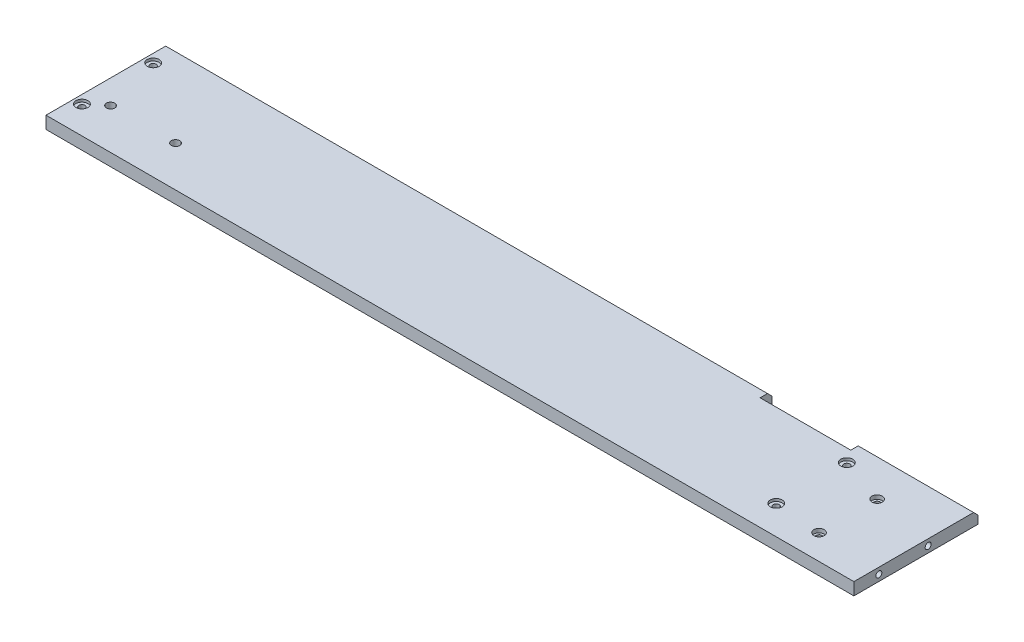
ISO-10303-21;
HEADER;
FILE_DESCRIPTION(('STEP AP214'),'2;1');
FILE_NAME('part.step','',(''),(''),'','','');
FILE_SCHEMA(('AUTOMOTIVE_DESIGN { 1 0 10303 214 1 1 1 1 }'));
ENDSEC;
DATA;
#1=APPLICATION_CONTEXT('core data for automotive mechanical design processes');
#2=APPLICATION_PROTOCOL_DEFINITION('international standard','automotive_design',2000,#1);
#3=PRODUCT_CONTEXT('',#1,'mechanical');
#4=PRODUCT('Part','Part','',(#3));
#5=PRODUCT_RELATED_PRODUCT_CATEGORY('part','',(#4));
#6=PRODUCT_DEFINITION_FORMATION('','',#4);
#7=PRODUCT_DEFINITION_CONTEXT('part definition',#1,'design');
#8=PRODUCT_DEFINITION('design','',#6,#7);
#9=PRODUCT_DEFINITION_SHAPE('','',#8);
#10=(LENGTH_UNIT() NAMED_UNIT(*) SI_UNIT(.MILLI.,.METRE.));
#11=(NAMED_UNIT(*) PLANE_ANGLE_UNIT() SI_UNIT($,.RADIAN.));
#12=(NAMED_UNIT(*) SI_UNIT($,.STERADIAN.) SOLID_ANGLE_UNIT());
#13=UNCERTAINTY_MEASURE_WITH_UNIT(LENGTH_MEASURE(1.E-05),#10,'distance_accuracy_value','');
#14=(GEOMETRIC_REPRESENTATION_CONTEXT(3) GLOBAL_UNCERTAINTY_ASSIGNED_CONTEXT((#13)) GLOBAL_UNIT_ASSIGNED_CONTEXT((#10,
#11,#12)) REPRESENTATION_CONTEXT('',''));
#15=CARTESIAN_POINT('',(0.,0.,0.));
#16=DIRECTION('',(0.,0.,1.));
#17=DIRECTION('',(1.,0.,0.));
#18=AXIS2_PLACEMENT_3D('',#15,#16,#17);
#19=CARTESIAN_POINT('',(0.,9.55,0.));
#20=DIRECTION('',(0.,0.,1.));
#21=DIRECTION('',(1.,0.,0.));
#22=AXIS2_PLACEMENT_3D('',#19,#20,#21);
#23=PLANE('',#22);
#24=DIRECTION('',(-1.,0.,0.));
#25=VECTOR('',#24,1.);
#26=CARTESIAN_POINT('',(0.,0.,0.));
#27=LINE('',#26,#25);
#28=CARTESIAN_POINT('',(622.,0.,0.));
#29=VERTEX_POINT('',#28);
#30=CARTESIAN_POINT('',(533.15,0.,0.));
#31=VERTEX_POINT('',#30);
#32=EDGE_CURVE('E238',#29,#31,#27,.T.);
#33=ORIENTED_EDGE('',*,*,#32,.T.);
#34=DIRECTION('',(0.,-1.,0.));
#35=VECTOR('',#34,1.);
#36=CARTESIAN_POINT('',(533.15,9.55,0.));
#37=LINE('',#36,#35);
#38=CARTESIAN_POINT('',(533.15,6.15000000000004,0.));
#39=VERTEX_POINT('',#38);
#40=EDGE_CURVE('E146',#39,#31,#37,.T.);
#41=ORIENTED_EDGE('',*,*,#40,.F.);
#42=DIRECTION('',(1.,0.,0.));
#43=VECTOR('',#42,1.);
#44=CARTESIAN_POINT('',(622.,6.15000000000004,0.));
#45=LINE('',#44,#43);
#46=CARTESIAN_POINT('',(622.,6.15000000000004,0.));
#47=VERTEX_POINT('',#46);
#48=EDGE_CURVE('E55',#39,#47,#45,.T.);
#49=ORIENTED_EDGE('',*,*,#48,.T.);
#50=DIRECTION('',(0.,-1.,0.));
#51=VECTOR('',#50,1.);
#52=CARTESIAN_POINT('',(622.,9.55,0.));
#53=LINE('',#52,#51);
#54=EDGE_CURVE('E255',#47,#29,#53,.T.);
#55=ORIENTED_EDGE('',*,*,#54,.T.);
#56=EDGE_LOOP('',(#33,#41,#49,#55));
#57=FACE_BOUND('',#56,.T.);
#58=ADVANCED_FACE('F32',(#57),#23,.F.);
#59=CARTESIAN_POINT('',(0.,9.55,3.39999999999996));
#60=DIRECTION('',(0.,0.707106781186548,-0.707106781186548));
#61=DIRECTION('',(0.,0.707106781186548,0.707106781186548));
#62=AXIS2_PLACEMENT_3D('',#59,#60,#61);
#63=PLANE('',#62);
#64=DIRECTION('',(0.,-0.707106781186548,-0.707106781186548));
#65=VECTOR('',#64,1.);
#66=CARTESIAN_POINT('',(533.15,9.55,3.39999999999996));
#67=LINE('',#66,#65);
#68=CARTESIAN_POINT('',(533.15,9.55,3.39999999999996));
#69=VERTEX_POINT('',#68);
#70=EDGE_CURVE('E11',#69,#39,#67,.T.);
#71=ORIENTED_EDGE('',*,*,#70,.F.);
#72=DIRECTION('',(-1.,0.,0.));
#73=VECTOR('',#72,1.);
#74=CARTESIAN_POINT('',(0.,9.55,3.39999999999996));
#75=LINE('',#74,#73);
#76=CARTESIAN_POINT('',(622.,9.55,3.39999999999996));
#77=VERTEX_POINT('',#76);
#78=EDGE_CURVE('E134',#77,#69,#75,.T.);
#79=ORIENTED_EDGE('',*,*,#78,.F.);
#80=DIRECTION('',(0.,0.707106781186548,0.707106781186548));
#81=VECTOR('',#80,1.);
#82=CARTESIAN_POINT('',(622.,9.55,3.39999999999996));
#83=LINE('',#82,#81);
#84=EDGE_CURVE('E270',#47,#77,#83,.T.);
#85=ORIENTED_EDGE('',*,*,#84,.F.);
#86=ORIENTED_EDGE('',*,*,#48,.F.);
#87=EDGE_LOOP('',(#71,#79,#85,#86));
#88=FACE_BOUND('',#87,.T.);
#89=ADVANCED_FACE('F291',(#88),#63,.T.);
#90=CARTESIAN_POINT('',(0.,9.55,0.));
#91=DIRECTION('',(1.,0.,0.));
#92=DIRECTION('',(0.,0.,-1.));
#93=AXIS2_PLACEMENT_3D('',#90,#91,#92);
#94=PLANE('',#93);
#95=DIRECTION('',(0.,0.,1.));
#96=VECTOR('',#95,1.);
#97=CARTESIAN_POINT('',(0.,9.55,0.));
#98=LINE('',#97,#96);
#99=CARTESIAN_POINT('',(0.,9.55,3.39999999999996));
#100=VERTEX_POINT('',#99);
#101=CARTESIAN_POINT('',(0.,9.55,95.56));
#102=VERTEX_POINT('',#101);
#103=EDGE_CURVE('E235',#100,#102,#98,.T.);
#104=ORIENTED_EDGE('',*,*,#103,.F.);
#105=DIRECTION('',(0.,-0.707106781186548,-0.707106781186548));
#106=VECTOR('',#105,1.);
#107=CARTESIAN_POINT('',(0.,9.55,3.39999999999996));
#108=LINE('',#107,#106);
#109=CARTESIAN_POINT('',(0.,6.15000000000004,0.));
#110=VERTEX_POINT('',#109);
#111=EDGE_CURVE('E265',#100,#110,#108,.T.);
#112=ORIENTED_EDGE('',*,*,#111,.T.);
#113=DIRECTION('',(0.,-1.,0.));
#114=VECTOR('',#113,1.);
#115=CARTESIAN_POINT('',(0.,9.55,0.));
#116=LINE('',#115,#114);
#117=CARTESIAN_POINT('',(0.,0.,0.));
#118=VERTEX_POINT('',#117);
#119=EDGE_CURVE('E242',#110,#118,#116,.T.);
#120=ORIENTED_EDGE('',*,*,#119,.T.);
#121=DIRECTION('',(0.,0.,1.));
#122=VECTOR('',#121,1.);
#123=CARTESIAN_POINT('',(0.,0.,0.));
#124=LINE('',#123,#122);
#125=CARTESIAN_POINT('',(0.,0.,95.56));
#126=VERTEX_POINT('',#125);
#127=EDGE_CURVE('E234',#118,#126,#124,.T.);
#128=ORIENTED_EDGE('',*,*,#127,.T.);
#129=DIRECTION('',(0.,-1.,0.));
#130=VECTOR('',#129,1.);
#131=CARTESIAN_POINT('',(0.,9.55,95.56));
#132=LINE('',#131,#130);
#133=EDGE_CURVE('E260',#102,#126,#132,.T.);
#134=ORIENTED_EDGE('',*,*,#133,.F.);
#135=EDGE_LOOP('',(#104,#112,#120,#128,#134));
#136=FACE_BOUND('',#135,.T.);
#137=ADVANCED_FACE('F280',(#136),#94,.F.);
#138=CARTESIAN_POINT('',(0.,9.55,95.56));
#139=DIRECTION('',(0.,0.,-1.));
#140=DIRECTION('',(-1.,0.,0.));
#141=AXIS2_PLACEMENT_3D('',#138,#139,#140);
#142=PLANE('',#141);
#143=DIRECTION('',(1.,0.,0.));
#144=VECTOR('',#143,1.);
#145=CARTESIAN_POINT('',(0.,0.,95.56));
#146=LINE('',#145,#144);
#147=CARTESIAN_POINT('',(622.,0.,95.56));
#148=VERTEX_POINT('',#147);
#149=EDGE_CURVE('E245',#126,#148,#146,.T.);
#150=ORIENTED_EDGE('',*,*,#149,.T.);
#151=DIRECTION('',(0.,-1.,0.));
#152=VECTOR('',#151,1.);
#153=CARTESIAN_POINT('',(622.,9.55,95.56));
#154=LINE('',#153,#152);
#155=CARTESIAN_POINT('',(622.,9.55,95.56));
#156=VERTEX_POINT('',#155);
#157=EDGE_CURVE('E257',#156,#148,#154,.T.);
#158=ORIENTED_EDGE('',*,*,#157,.F.);
#159=DIRECTION('',(1.,0.,0.));
#160=VECTOR('',#159,1.);
#161=CARTESIAN_POINT('',(0.,9.55,95.56));
#162=LINE('',#161,#160);
#163=EDGE_CURVE('E237',#102,#156,#162,.T.);
#164=ORIENTED_EDGE('',*,*,#163,.F.);
#165=ORIENTED_EDGE('',*,*,#133,.T.);
#166=EDGE_LOOP('',(#150,#158,#164,#165));
#167=FACE_BOUND('',#166,.T.);
#168=ADVANCED_FACE('F284',(#167),#142,.F.);
#169=CARTESIAN_POINT('',(622.,9.55,0.));
#170=DIRECTION('',(-1.,0.,0.));
#171=DIRECTION('',(0.,0.,1.));
#172=AXIS2_PLACEMENT_3D('',#169,#170,#171);
#173=PLANE('',#172);
#174=CARTESIAN_POINT('',(622.,4.775,76.36));
#175=DIRECTION('',(1.,0.,0.));
#176=DIRECTION('',(0.,0.,-1.));
#177=AXIS2_PLACEMENT_3D('',#174,#175,#176);
#178=CIRCLE('',#177,2.30000000000001);
#179=CARTESIAN_POINT('',(622.,4.775,74.06));
#180=VERTEX_POINT('',#179);
#181=EDGE_CURVE('E701',#180,#180,#178,.T.);
#182=ORIENTED_EDGE('',*,*,#181,.F.);
#183=EDGE_LOOP('',(#182));
#184=FACE_BOUND('',#183,.T.);
#185=CARTESIAN_POINT('',(622.,4.775,38.38));
#186=DIRECTION('',(1.,0.,0.));
#187=DIRECTION('',(0.,0.,-1.));
#188=AXIS2_PLACEMENT_3D('',#185,#186,#187);
#189=CIRCLE('',#188,2.30000000000001);
#190=CARTESIAN_POINT('',(622.,4.775,36.08));
#191=VERTEX_POINT('',#190);
#192=EDGE_CURVE('E703',#191,#191,#189,.T.);
#193=ORIENTED_EDGE('',*,*,#192,.F.);
#194=EDGE_LOOP('',(#193));
#195=FACE_BOUND('',#194,.T.);
#196=ORIENTED_EDGE('',*,*,#54,.F.);
#197=ORIENTED_EDGE('',*,*,#84,.T.);
#198=DIRECTION('',(0.,0.,-1.));
#199=VECTOR('',#198,1.);
#200=CARTESIAN_POINT('',(622.,9.55,0.));
#201=LINE('',#200,#199);
#202=EDGE_CURVE('E240',#156,#77,#201,.T.);
#203=ORIENTED_EDGE('',*,*,#202,.F.);
#204=ORIENTED_EDGE('',*,*,#157,.T.);
#205=DIRECTION('',(0.,0.,-1.));
#206=VECTOR('',#205,1.);
#207=CARTESIAN_POINT('',(622.,0.,0.));
#208=LINE('',#207,#206);
#209=EDGE_CURVE('E247',#148,#29,#208,.T.);
#210=ORIENTED_EDGE('',*,*,#209,.T.);
#211=EDGE_LOOP('',(#196,#197,#203,#204,#210));
#212=FACE_BOUND('',#211,.T.);
#213=ADVANCED_FACE('F288',(#184,#195,#212),#173,.F.);
#214=CARTESIAN_POINT('',(463.34,6.15000000000004,0.));
#215=VERTEX_POINT('',#214);
#216=EDGE_CURVE('E267',#110,#215,#45,.T.);
#217=ORIENTED_EDGE('',*,*,#216,.T.);
#218=DIRECTION('',(0.,-1.,0.));
#219=VECTOR('',#218,1.);
#220=CARTESIAN_POINT('',(463.34,9.55,0.));
#221=LINE('',#220,#219);
#222=CARTESIAN_POINT('',(463.34,0.,0.));
#223=VERTEX_POINT('',#222);
#224=EDGE_CURVE('E47',#215,#223,#221,.T.);
#225=ORIENTED_EDGE('',*,*,#224,.T.);
#226=EDGE_CURVE('E250',#223,#118,#27,.T.);
#227=ORIENTED_EDGE('',*,*,#226,.T.);
#228=ORIENTED_EDGE('',*,*,#119,.F.);
#229=EDGE_LOOP('',(#217,#225,#227,#228));
#230=FACE_BOUND('',#229,.T.);
#231=ADVANCED_FACE('F299',(#230),#23,.F.);
#232=CARTESIAN_POINT('',(0.,9.55,95.56));
#233=DIRECTION('',(0.,1.,0.));
#234=DIRECTION('',(0.,0.,1.));
#235=AXIS2_PLACEMENT_3D('',#232,#233,#234);
#236=PLANE('',#235);
#237=DIRECTION('',(0.,0.,1.));
#238=VECTOR('',#237,1.);
#239=CARTESIAN_POINT('',(533.15,9.55,0.));
#240=LINE('',#239,#238);
#241=CARTESIAN_POINT('',(533.15,9.55,9.1));
#242=VERTEX_POINT('',#241);
#243=EDGE_CURVE('E112',#69,#242,#240,.T.);
#244=ORIENTED_EDGE('',*,*,#243,.T.);
#245=DIRECTION('',(-1.,0.,0.));
#246=VECTOR('',#245,1.);
#247=CARTESIAN_POINT('',(533.15,9.55,9.1));
#248=LINE('',#247,#246);
#249=CARTESIAN_POINT('',(463.34,9.55,9.09999999999999));
#250=VERTEX_POINT('',#249);
#251=EDGE_CURVE('E123',#242,#250,#248,.T.);
#252=ORIENTED_EDGE('',*,*,#251,.T.);
#253=DIRECTION('',(0.,0.,-1.));
#254=VECTOR('',#253,1.);
#255=CARTESIAN_POINT('',(463.34,9.55,0.));
#256=LINE('',#255,#254);
#257=CARTESIAN_POINT('',(463.34,9.55,3.39999999999996));
#258=VERTEX_POINT('',#257);
#259=EDGE_CURVE('E120',#250,#258,#256,.T.);
#260=ORIENTED_EDGE('',*,*,#259,.T.);
#261=EDGE_CURVE('E263',#258,#100,#75,.T.);
#262=ORIENTED_EDGE('',*,*,#261,.T.);
#263=ORIENTED_EDGE('',*,*,#103,.T.);
#264=ORIENTED_EDGE('',*,*,#163,.T.);
#265=ORIENTED_EDGE('',*,*,#202,.T.);
#266=ORIENTED_EDGE('',*,*,#78,.T.);
#267=EDGE_LOOP('',(#244,#252,#260,#262,#263,#264,#265,#266));
#268=FACE_BOUND('',#267,.T.);
#269=CARTESIAN_POINT('',(575.95,9.55,31.61));
#270=DIRECTION('',(0.,1.,0.));
#271=DIRECTION('',(0.,0.,1.));
#272=AXIS2_PLACEMENT_3D('',#269,#270,#271);
#273=CIRCLE('',#272,4.);
#274=CARTESIAN_POINT('',(575.95,9.55,35.61));
#275=VERTEX_POINT('',#274);
#276=EDGE_CURVE('E148',#275,#275,#273,.T.);
#277=ORIENTED_EDGE('',*,*,#276,.F.);
#278=EDGE_LOOP('',(#277));
#279=FACE_BOUND('',#278,.T.);
#280=CARTESIAN_POINT('',(575.95,9.55,76.32));
#281=DIRECTION('',(0.,1.,0.));
#282=DIRECTION('',(0.,0.,1.));
#283=AXIS2_PLACEMENT_3D('',#280,#281,#282);
#284=CIRCLE('',#283,4.);
#285=CARTESIAN_POINT('',(575.95,9.55,80.32));
#286=VERTEX_POINT('',#285);
#287=EDGE_CURVE('E162',#286,#286,#284,.T.);
#288=ORIENTED_EDGE('',*,*,#287,.F.);
#289=EDGE_LOOP('',(#288));
#290=FACE_BOUND('',#289,.T.);
#291=CARTESIAN_POINT('',(6.4,9.55,19.45));
#292=DIRECTION('',(0.,1.,0.));
#293=DIRECTION('',(0.,0.,1.));
#294=AXIS2_PLACEMENT_3D('',#291,#292,#293);
#295=CIRCLE('',#294,4.60000000000001);
#296=CARTESIAN_POINT('',(6.4,9.55,24.05));
#297=VERTEX_POINT('',#296);
#298=EDGE_CURVE('E174',#297,#297,#295,.T.);
#299=ORIENTED_EDGE('',*,*,#298,.F.);
#300=EDGE_LOOP('',(#299));
#301=FACE_BOUND('',#300,.T.);
#302=CARTESIAN_POINT('',(6.4,9.55,74.31));
#303=DIRECTION('',(0.,1.,0.));
#304=DIRECTION('',(0.,0.,1.));
#305=AXIS2_PLACEMENT_3D('',#302,#303,#304);
#306=CIRCLE('',#305,4.60000000000001);
#307=CARTESIAN_POINT('',(6.4,9.55,78.91));
#308=VERTEX_POINT('',#307);
#309=EDGE_CURVE('E186',#308,#308,#306,.T.);
#310=ORIENTED_EDGE('',*,*,#309,.F.);
#311=EDGE_LOOP('',(#310));
#312=FACE_BOUND('',#311,.T.);
#313=CARTESIAN_POINT('',(539.95,9.55,18.95));
#314=DIRECTION('',(0.,1.,0.));
#315=DIRECTION('',(0.,0.,1.));
#316=AXIS2_PLACEMENT_3D('',#313,#314,#315);
#317=CIRCLE('',#316,4.60000000000005);
#318=CARTESIAN_POINT('',(539.95,9.55,23.5500000000001));
#319=VERTEX_POINT('',#318);
#320=EDGE_CURVE('E198',#319,#319,#317,.T.);
#321=ORIENTED_EDGE('',*,*,#320,.F.);
#322=EDGE_LOOP('',(#321));
#323=FACE_BOUND('',#322,.T.);
#324=CARTESIAN_POINT('',(539.95,9.55,73.28));
#325=DIRECTION('',(0.,1.,0.));
#326=DIRECTION('',(0.,0.,1.));
#327=AXIS2_PLACEMENT_3D('',#324,#325,#326);
#328=CIRCLE('',#327,4.60000000000005);
#329=CARTESIAN_POINT('',(539.95,9.55,77.8800000000001));
#330=VERTEX_POINT('',#329);
#331=EDGE_CURVE('E210',#330,#330,#328,.T.);
#332=ORIENTED_EDGE('',*,*,#331,.F.);
#333=EDGE_LOOP('',(#332));
#334=FACE_BOUND('',#333,.T.);
#335=CARTESIAN_POINT('',(18.475,9.55,64.285));
#336=DIRECTION('',(0.,1.,0.));
#337=DIRECTION('',(0.,0.,1.));
#338=AXIS2_PLACEMENT_3D('',#335,#336,#337);
#339=CIRCLE('',#338,3.25000000000001);
#340=CARTESIAN_POINT('',(18.475,9.55,67.535));
#341=VERTEX_POINT('',#340);
#342=EDGE_CURVE('E222',#341,#341,#339,.T.);
#343=ORIENTED_EDGE('',*,*,#342,.F.);
#344=EDGE_LOOP('',(#343));
#345=FACE_BOUND('',#344,.T.);
#346=CARTESIAN_POINT('',(68.475,9.55,64.285));
#347=DIRECTION('',(0.,1.,0.));
#348=DIRECTION('',(0.,0.,1.));
#349=AXIS2_PLACEMENT_3D('',#346,#347,#348);
#350=CIRCLE('',#349,3.25000000000002);
#351=CARTESIAN_POINT('',(68.475,9.55,67.535));
#352=VERTEX_POINT('',#351);
#353=EDGE_CURVE('E228',#352,#352,#350,.T.);
#354=ORIENTED_EDGE('',*,*,#353,.F.);
#355=EDGE_LOOP('',(#354));
#356=FACE_BOUND('',#355,.T.);
#357=ADVANCED_FACE('F130',(#268,#279,#290,#301,#312,#323,#334,#345,#356),#236,.T.);
#358=CARTESIAN_POINT('',(0.,0.,95.56));
#359=DIRECTION('',(0.,1.,0.));
#360=DIRECTION('',(0.,0.,1.));
#361=AXIS2_PLACEMENT_3D('',#358,#359,#360);
#362=PLANE('',#361);
#363=CARTESIAN_POINT('',(575.95,0.,31.61));
#364=DIRECTION('',(0.,1.,0.));
#365=DIRECTION('',(0.,0.,1.));
#366=AXIS2_PLACEMENT_3D('',#363,#364,#365);
#367=CIRCLE('',#366,2.29999999999997);
#368=CARTESIAN_POINT('',(575.95,0.,33.91));
#369=VERTEX_POINT('',#368);
#370=EDGE_CURVE('E159',#369,#369,#367,.T.);
#371=ORIENTED_EDGE('',*,*,#370,.T.);
#372=EDGE_LOOP('',(#371));
#373=FACE_BOUND('',#372,.T.);
#374=CARTESIAN_POINT('',(575.95,0.,76.32));
#375=DIRECTION('',(0.,1.,0.));
#376=DIRECTION('',(0.,0.,1.));
#377=AXIS2_PLACEMENT_3D('',#374,#375,#376);
#378=CIRCLE('',#377,2.29999999999997);
#379=CARTESIAN_POINT('',(575.95,0.,78.62));
#380=VERTEX_POINT('',#379);
#381=EDGE_CURVE('E171',#380,#380,#378,.T.);
#382=ORIENTED_EDGE('',*,*,#381,.T.);
#383=EDGE_LOOP('',(#382));
#384=FACE_BOUND('',#383,.T.);
#385=CARTESIAN_POINT('',(6.4,0.,19.45));
#386=DIRECTION('',(0.,1.,0.));
#387=DIRECTION('',(0.,0.,1.));
#388=AXIS2_PLACEMENT_3D('',#385,#386,#387);
#389=CIRCLE('',#388,2.30000000000001);
#390=CARTESIAN_POINT('',(6.4,0.,21.75));
#391=VERTEX_POINT('',#390);
#392=EDGE_CURVE('E183',#391,#391,#389,.T.);
#393=ORIENTED_EDGE('',*,*,#392,.T.);
#394=EDGE_LOOP('',(#393));
#395=FACE_BOUND('',#394,.T.);
#396=CARTESIAN_POINT('',(6.4,0.,74.31));
#397=DIRECTION('',(0.,1.,0.));
#398=DIRECTION('',(0.,0.,1.));
#399=AXIS2_PLACEMENT_3D('',#396,#397,#398);
#400=CIRCLE('',#399,2.30000000000001);
#401=CARTESIAN_POINT('',(6.4,0.,76.61));
#402=VERTEX_POINT('',#401);
#403=EDGE_CURVE('E195',#402,#402,#400,.T.);
#404=ORIENTED_EDGE('',*,*,#403,.T.);
#405=EDGE_LOOP('',(#404));
#406=FACE_BOUND('',#405,.T.);
#407=CARTESIAN_POINT('',(539.95,0.,18.95));
#408=DIRECTION('',(0.,1.,0.));
#409=DIRECTION('',(0.,0.,1.));
#410=AXIS2_PLACEMENT_3D('',#407,#408,#409);
#411=CIRCLE('',#410,2.29999999999997);
#412=CARTESIAN_POINT('',(539.95,0.,21.25));
#413=VERTEX_POINT('',#412);
#414=EDGE_CURVE('E207',#413,#413,#411,.T.);
#415=ORIENTED_EDGE('',*,*,#414,.T.);
#416=EDGE_LOOP('',(#415));
#417=FACE_BOUND('',#416,.T.);
#418=CARTESIAN_POINT('',(539.95,0.,73.28));
#419=DIRECTION('',(0.,1.,0.));
#420=DIRECTION('',(0.,0.,1.));
#421=AXIS2_PLACEMENT_3D('',#418,#419,#420);
#422=CIRCLE('',#421,2.29999999999997);
#423=CARTESIAN_POINT('',(539.95,0.,75.58));
#424=VERTEX_POINT('',#423);
#425=EDGE_CURVE('E219',#424,#424,#422,.T.);
#426=ORIENTED_EDGE('',*,*,#425,.T.);
#427=EDGE_LOOP('',(#426));
#428=FACE_BOUND('',#427,.T.);
#429=CARTESIAN_POINT('',(18.475,0.,64.285));
#430=DIRECTION('',(0.,1.,0.));
#431=DIRECTION('',(0.,0.,1.));
#432=AXIS2_PLACEMENT_3D('',#429,#430,#431);
#433=CIRCLE('',#432,3.25000000000001);
#434=CARTESIAN_POINT('',(18.475,0.,67.535));
#435=VERTEX_POINT('',#434);
#436=EDGE_CURVE('E225',#435,#435,#433,.T.);
#437=ORIENTED_EDGE('',*,*,#436,.T.);
#438=EDGE_LOOP('',(#437));
#439=FACE_BOUND('',#438,.T.);
#440=CARTESIAN_POINT('',(68.475,0.,64.285));
#441=DIRECTION('',(0.,1.,0.));
#442=DIRECTION('',(0.,0.,1.));
#443=AXIS2_PLACEMENT_3D('',#440,#441,#442);
#444=CIRCLE('',#443,3.25000000000002);
#445=CARTESIAN_POINT('',(68.475,0.,67.535));
#446=VERTEX_POINT('',#445);
#447=EDGE_CURVE('E231',#446,#446,#444,.T.);
#448=ORIENTED_EDGE('',*,*,#447,.T.);
#449=EDGE_LOOP('',(#448));
#450=FACE_BOUND('',#449,.T.);
#451=DIRECTION('',(-1.,0.,0.));
#452=VECTOR('',#451,1.);
#453=CARTESIAN_POINT('',(533.15,0.,9.1));
#454=LINE('',#453,#452);
#455=CARTESIAN_POINT('',(533.15,0.,9.1));
#456=VERTEX_POINT('',#455);
#457=CARTESIAN_POINT('',(463.34,0.,9.09999999999999));
#458=VERTEX_POINT('',#457);
#459=EDGE_CURVE('E137',#456,#458,#454,.T.);
#460=ORIENTED_EDGE('',*,*,#459,.F.);
#461=DIRECTION('',(0.,0.,1.));
#462=VECTOR('',#461,1.);
#463=CARTESIAN_POINT('',(533.15,0.,0.));
#464=LINE('',#463,#462);
#465=EDGE_CURVE('E115',#31,#456,#464,.T.);
#466=ORIENTED_EDGE('',*,*,#465,.F.);
#467=ORIENTED_EDGE('',*,*,#32,.F.);
#468=ORIENTED_EDGE('',*,*,#209,.F.);
#469=ORIENTED_EDGE('',*,*,#149,.F.);
#470=ORIENTED_EDGE('',*,*,#127,.F.);
#471=ORIENTED_EDGE('',*,*,#226,.F.);
#472=DIRECTION('',(0.,0.,-1.));
#473=VECTOR('',#472,1.);
#474=CARTESIAN_POINT('',(463.34,0.,0.));
#475=LINE('',#474,#473);
#476=EDGE_CURVE('E135',#458,#223,#475,.T.);
#477=ORIENTED_EDGE('',*,*,#476,.F.);
#478=EDGE_LOOP('',(#460,#466,#467,#468,#469,#470,#471,#477));
#479=FACE_BOUND('',#478,.T.);
#480=ADVANCED_FACE('F294',(#373,#384,#395,#406,#417,#428,#439,#450,#479),#362,.F.);
#481=CARTESIAN_POINT('',(68.475,9.55,64.285));
#482=DIRECTION('',(0.,1.,0.));
#483=DIRECTION('',(0.,0.,1.));
#484=AXIS2_PLACEMENT_3D('',#481,#482,#483);
#485=CYLINDRICAL_SURFACE('',#484,3.25000000000002);
#486=ORIENTED_EDGE('',*,*,#447,.F.);
#487=EDGE_LOOP('',(#486));
#488=FACE_BOUND('',#487,.T.);
#489=ORIENTED_EDGE('',*,*,#353,.T.);
#490=EDGE_LOOP('',(#489));
#491=FACE_BOUND('',#490,.T.);
#492=ADVANCED_FACE('F403',(#488,#491),#485,.F.);
#493=CARTESIAN_POINT('',(18.475,9.55,64.285));
#494=DIRECTION('',(0.,1.,0.));
#495=DIRECTION('',(0.,0.,1.));
#496=AXIS2_PLACEMENT_3D('',#493,#494,#495);
#497=CYLINDRICAL_SURFACE('',#496,3.25000000000001);
#498=ORIENTED_EDGE('',*,*,#436,.F.);
#499=EDGE_LOOP('',(#498));
#500=FACE_BOUND('',#499,.T.);
#501=ORIENTED_EDGE('',*,*,#342,.T.);
#502=EDGE_LOOP('',(#501));
#503=FACE_BOUND('',#502,.T.);
#504=ADVANCED_FACE('F399',(#500,#503),#497,.F.);
#505=CARTESIAN_POINT('',(539.95,9.55,73.28));
#506=DIRECTION('',(0.,1.,0.));
#507=DIRECTION('',(0.,0.,1.));
#508=AXIS2_PLACEMENT_3D('',#505,#506,#507);
#509=CYLINDRICAL_SURFACE('',#508,2.29999999999997);
#510=ORIENTED_EDGE('',*,*,#425,.F.);
#511=EDGE_LOOP('',(#510));
#512=FACE_BOUND('',#511,.T.);
#513=CARTESIAN_POINT('',(539.95,7.55,73.28));
#514=DIRECTION('',(0.,1.,0.));
#515=DIRECTION('',(0.,0.,1.));
#516=AXIS2_PLACEMENT_3D('',#513,#514,#515);
#517=CIRCLE('',#516,2.29999999999997);
#518=CARTESIAN_POINT('',(539.95,7.55,75.58));
#519=VERTEX_POINT('',#518);
#520=EDGE_CURVE('E216',#519,#519,#517,.T.);
#521=ORIENTED_EDGE('',*,*,#520,.T.);
#522=EDGE_LOOP('',(#521));
#523=FACE_BOUND('',#522,.T.);
#524=ADVANCED_FACE('F395',(#512,#523),#509,.F.);
#525=CARTESIAN_POINT('',(542.25,7.55,73.28));
#526=DIRECTION('',(0.,-1.,0.));
#527=DIRECTION('',(0.,0.,-1.));
#528=AXIS2_PLACEMENT_3D('',#525,#526,#527);
#529=PLANE('',#528);
#530=ORIENTED_EDGE('',*,*,#520,.F.);
#531=EDGE_LOOP('',(#530));
#532=FACE_BOUND('',#531,.T.);
#533=CARTESIAN_POINT('',(539.95,7.55,73.28));
#534=DIRECTION('',(0.,1.,0.));
#535=DIRECTION('',(0.,0.,1.));
#536=AXIS2_PLACEMENT_3D('',#533,#534,#535);
#537=CIRCLE('',#536,4.60000000000005);
#538=CARTESIAN_POINT('',(539.95,7.55,77.8800000000001));
#539=VERTEX_POINT('',#538);
#540=EDGE_CURVE('E213',#539,#539,#537,.T.);
#541=ORIENTED_EDGE('',*,*,#540,.T.);
#542=EDGE_LOOP('',(#541));
#543=FACE_BOUND('',#542,.T.);
#544=ADVANCED_FACE('F391',(#532,#543),#529,.F.);
#545=CARTESIAN_POINT('',(539.95,9.55,73.28));
#546=DIRECTION('',(0.,1.,0.));
#547=DIRECTION('',(0.,0.,1.));
#548=AXIS2_PLACEMENT_3D('',#545,#546,#547);
#549=CYLINDRICAL_SURFACE('',#548,4.60000000000005);
#550=ORIENTED_EDGE('',*,*,#540,.F.);
#551=EDGE_LOOP('',(#550));
#552=FACE_BOUND('',#551,.T.);
#553=ORIENTED_EDGE('',*,*,#331,.T.);
#554=EDGE_LOOP('',(#553));
#555=FACE_BOUND('',#554,.T.);
#556=ADVANCED_FACE('F387',(#552,#555),#549,.F.);
#557=CARTESIAN_POINT('',(539.95,9.55,18.95));
#558=DIRECTION('',(0.,1.,0.));
#559=DIRECTION('',(0.,0.,1.));
#560=AXIS2_PLACEMENT_3D('',#557,#558,#559);
#561=CYLINDRICAL_SURFACE('',#560,2.29999999999997);
#562=ORIENTED_EDGE('',*,*,#414,.F.);
#563=EDGE_LOOP('',(#562));
#564=FACE_BOUND('',#563,.T.);
#565=CARTESIAN_POINT('',(539.95,7.55,18.95));
#566=DIRECTION('',(0.,1.,0.));
#567=DIRECTION('',(0.,0.,1.));
#568=AXIS2_PLACEMENT_3D('',#565,#566,#567);
#569=CIRCLE('',#568,2.29999999999997);
#570=CARTESIAN_POINT('',(539.95,7.55,21.25));
#571=VERTEX_POINT('',#570);
#572=EDGE_CURVE('E204',#571,#571,#569,.T.);
#573=ORIENTED_EDGE('',*,*,#572,.T.);
#574=EDGE_LOOP('',(#573));
#575=FACE_BOUND('',#574,.T.);
#576=ADVANCED_FACE('F383',(#564,#575),#561,.F.);
#577=CARTESIAN_POINT('',(542.25,7.55,18.95));
#578=DIRECTION('',(0.,-1.,0.));
#579=DIRECTION('',(0.,0.,-1.));
#580=AXIS2_PLACEMENT_3D('',#577,#578,#579);
#581=PLANE('',#580);
#582=ORIENTED_EDGE('',*,*,#572,.F.);
#583=EDGE_LOOP('',(#582));
#584=FACE_BOUND('',#583,.T.);
#585=CARTESIAN_POINT('',(539.95,7.55,18.95));
#586=DIRECTION('',(0.,1.,0.));
#587=DIRECTION('',(0.,0.,1.));
#588=AXIS2_PLACEMENT_3D('',#585,#586,#587);
#589=CIRCLE('',#588,4.60000000000005);
#590=CARTESIAN_POINT('',(539.95,7.55,23.5500000000001));
#591=VERTEX_POINT('',#590);
#592=EDGE_CURVE('E201',#591,#591,#589,.T.);
#593=ORIENTED_EDGE('',*,*,#592,.T.);
#594=EDGE_LOOP('',(#593));
#595=FACE_BOUND('',#594,.T.);
#596=ADVANCED_FACE('F379',(#584,#595),#581,.F.);
#597=CARTESIAN_POINT('',(539.95,9.55,18.95));
#598=DIRECTION('',(0.,1.,0.));
#599=DIRECTION('',(0.,0.,1.));
#600=AXIS2_PLACEMENT_3D('',#597,#598,#599);
#601=CYLINDRICAL_SURFACE('',#600,4.60000000000005);
#602=ORIENTED_EDGE('',*,*,#592,.F.);
#603=EDGE_LOOP('',(#602));
#604=FACE_BOUND('',#603,.T.);
#605=ORIENTED_EDGE('',*,*,#320,.T.);
#606=EDGE_LOOP('',(#605));
#607=FACE_BOUND('',#606,.T.);
#608=ADVANCED_FACE('F375',(#604,#607),#601,.F.);
#609=CARTESIAN_POINT('',(6.4,9.55,74.31));
#610=DIRECTION('',(0.,1.,0.));
#611=DIRECTION('',(0.,0.,1.));
#612=AXIS2_PLACEMENT_3D('',#609,#610,#611);
#613=CYLINDRICAL_SURFACE('',#612,2.30000000000001);
#614=ORIENTED_EDGE('',*,*,#403,.F.);
#615=EDGE_LOOP('',(#614));
#616=FACE_BOUND('',#615,.T.);
#617=CARTESIAN_POINT('',(6.4,7.55,74.31));
#618=DIRECTION('',(0.,1.,0.));
#619=DIRECTION('',(0.,0.,1.));
#620=AXIS2_PLACEMENT_3D('',#617,#618,#619);
#621=CIRCLE('',#620,2.30000000000001);
#622=CARTESIAN_POINT('',(6.4,7.55,76.61));
#623=VERTEX_POINT('',#622);
#624=EDGE_CURVE('E192',#623,#623,#621,.T.);
#625=ORIENTED_EDGE('',*,*,#624,.T.);
#626=EDGE_LOOP('',(#625));
#627=FACE_BOUND('',#626,.T.);
#628=ADVANCED_FACE('F371',(#616,#627),#613,.F.);
#629=CARTESIAN_POINT('',(8.70000000000001,7.55,74.31));
#630=DIRECTION('',(0.,-1.,0.));
#631=DIRECTION('',(0.,0.,-1.));
#632=AXIS2_PLACEMENT_3D('',#629,#630,#631);
#633=PLANE('',#632);
#634=ORIENTED_EDGE('',*,*,#624,.F.);
#635=EDGE_LOOP('',(#634));
#636=FACE_BOUND('',#635,.T.);
#637=CARTESIAN_POINT('',(6.4,7.55,74.31));
#638=DIRECTION('',(0.,1.,0.));
#639=DIRECTION('',(0.,0.,1.));
#640=AXIS2_PLACEMENT_3D('',#637,#638,#639);
#641=CIRCLE('',#640,4.60000000000001);
#642=CARTESIAN_POINT('',(6.4,7.55,78.91));
#643=VERTEX_POINT('',#642);
#644=EDGE_CURVE('E189',#643,#643,#641,.T.);
#645=ORIENTED_EDGE('',*,*,#644,.T.);
#646=EDGE_LOOP('',(#645));
#647=FACE_BOUND('',#646,.T.);
#648=ADVANCED_FACE('F367',(#636,#647),#633,.F.);
#649=CARTESIAN_POINT('',(6.4,9.55,74.31));
#650=DIRECTION('',(0.,1.,0.));
#651=DIRECTION('',(0.,0.,1.));
#652=AXIS2_PLACEMENT_3D('',#649,#650,#651);
#653=CYLINDRICAL_SURFACE('',#652,4.60000000000001);
#654=ORIENTED_EDGE('',*,*,#644,.F.);
#655=EDGE_LOOP('',(#654));
#656=FACE_BOUND('',#655,.T.);
#657=ORIENTED_EDGE('',*,*,#309,.T.);
#658=EDGE_LOOP('',(#657));
#659=FACE_BOUND('',#658,.T.);
#660=ADVANCED_FACE('F363',(#656,#659),#653,.F.);
#661=CARTESIAN_POINT('',(6.4,9.55,19.45));
#662=DIRECTION('',(0.,1.,0.));
#663=DIRECTION('',(0.,0.,1.));
#664=AXIS2_PLACEMENT_3D('',#661,#662,#663);
#665=CYLINDRICAL_SURFACE('',#664,2.30000000000001);
#666=ORIENTED_EDGE('',*,*,#392,.F.);
#667=EDGE_LOOP('',(#666));
#668=FACE_BOUND('',#667,.T.);
#669=CARTESIAN_POINT('',(6.4,7.55,19.45));
#670=DIRECTION('',(0.,1.,0.));
#671=DIRECTION('',(0.,0.,1.));
#672=AXIS2_PLACEMENT_3D('',#669,#670,#671);
#673=CIRCLE('',#672,2.30000000000001);
#674=CARTESIAN_POINT('',(6.4,7.55,21.75));
#675=VERTEX_POINT('',#674);
#676=EDGE_CURVE('E180',#675,#675,#673,.T.);
#677=ORIENTED_EDGE('',*,*,#676,.T.);
#678=EDGE_LOOP('',(#677));
#679=FACE_BOUND('',#678,.T.);
#680=ADVANCED_FACE('F359',(#668,#679),#665,.F.);
#681=CARTESIAN_POINT('',(8.70000000000001,7.55,19.45));
#682=DIRECTION('',(0.,-1.,0.));
#683=DIRECTION('',(0.,0.,-1.));
#684=AXIS2_PLACEMENT_3D('',#681,#682,#683);
#685=PLANE('',#684);
#686=ORIENTED_EDGE('',*,*,#676,.F.);
#687=EDGE_LOOP('',(#686));
#688=FACE_BOUND('',#687,.T.);
#689=CARTESIAN_POINT('',(6.4,7.55,19.45));
#690=DIRECTION('',(0.,1.,0.));
#691=DIRECTION('',(0.,0.,1.));
#692=AXIS2_PLACEMENT_3D('',#689,#690,#691);
#693=CIRCLE('',#692,4.60000000000001);
#694=CARTESIAN_POINT('',(6.4,7.55,24.05));
#695=VERTEX_POINT('',#694);
#696=EDGE_CURVE('E177',#695,#695,#693,.T.);
#697=ORIENTED_EDGE('',*,*,#696,.T.);
#698=EDGE_LOOP('',(#697));
#699=FACE_BOUND('',#698,.T.);
#700=ADVANCED_FACE('F355',(#688,#699),#685,.F.);
#701=CARTESIAN_POINT('',(6.4,9.55,19.45));
#702=DIRECTION('',(0.,1.,0.));
#703=DIRECTION('',(0.,0.,1.));
#704=AXIS2_PLACEMENT_3D('',#701,#702,#703);
#705=CYLINDRICAL_SURFACE('',#704,4.60000000000001);
#706=ORIENTED_EDGE('',*,*,#696,.F.);
#707=EDGE_LOOP('',(#706));
#708=FACE_BOUND('',#707,.T.);
#709=ORIENTED_EDGE('',*,*,#298,.T.);
#710=EDGE_LOOP('',(#709));
#711=FACE_BOUND('',#710,.T.);
#712=ADVANCED_FACE('F351',(#708,#711),#705,.F.);
#713=CARTESIAN_POINT('',(575.95,9.55,76.32));
#714=DIRECTION('',(0.,1.,0.));
#715=DIRECTION('',(0.,0.,1.));
#716=AXIS2_PLACEMENT_3D('',#713,#714,#715);
#717=CYLINDRICAL_SURFACE('',#716,2.29999999999997);
#718=ORIENTED_EDGE('',*,*,#381,.F.);
#719=EDGE_LOOP('',(#718));
#720=FACE_BOUND('',#719,.T.);
#721=CARTESIAN_POINT('',(575.95,6.55,76.32));
#722=DIRECTION('',(0.,1.,0.));
#723=DIRECTION('',(0.,0.,1.));
#724=AXIS2_PLACEMENT_3D('',#721,#722,#723);
#725=CIRCLE('',#724,2.29999999999997);
#726=CARTESIAN_POINT('',(575.95,6.55,78.62));
#727=VERTEX_POINT('',#726);
#728=EDGE_CURVE('E168',#727,#727,#725,.T.);
#729=ORIENTED_EDGE('',*,*,#728,.T.);
#730=EDGE_LOOP('',(#729));
#731=FACE_BOUND('',#730,.T.);
#732=ADVANCED_FACE('F347',(#720,#731),#717,.F.);
#733=CARTESIAN_POINT('',(578.25,6.55,76.32));
#734=DIRECTION('',(0.,-1.,0.));
#735=DIRECTION('',(0.,0.,-1.));
#736=AXIS2_PLACEMENT_3D('',#733,#734,#735);
#737=PLANE('',#736);
#738=ORIENTED_EDGE('',*,*,#728,.F.);
#739=EDGE_LOOP('',(#738));
#740=FACE_BOUND('',#739,.T.);
#741=CARTESIAN_POINT('',(575.95,6.55,76.32));
#742=DIRECTION('',(0.,1.,0.));
#743=DIRECTION('',(0.,0.,1.));
#744=AXIS2_PLACEMENT_3D('',#741,#742,#743);
#745=CIRCLE('',#744,4.);
#746=CARTESIAN_POINT('',(575.95,6.55,80.32));
#747=VERTEX_POINT('',#746);
#748=EDGE_CURVE('E165',#747,#747,#745,.T.);
#749=ORIENTED_EDGE('',*,*,#748,.T.);
#750=EDGE_LOOP('',(#749));
#751=FACE_BOUND('',#750,.T.);
#752=ADVANCED_FACE('F343',(#740,#751),#737,.F.);
#753=CARTESIAN_POINT('',(575.95,9.55,76.32));
#754=DIRECTION('',(0.,1.,0.));
#755=DIRECTION('',(0.,0.,1.));
#756=AXIS2_PLACEMENT_3D('',#753,#754,#755);
#757=CYLINDRICAL_SURFACE('',#756,4.);
#758=ORIENTED_EDGE('',*,*,#748,.F.);
#759=EDGE_LOOP('',(#758));
#760=FACE_BOUND('',#759,.T.);
#761=ORIENTED_EDGE('',*,*,#287,.T.);
#762=EDGE_LOOP('',(#761));
#763=FACE_BOUND('',#762,.T.);
#764=ADVANCED_FACE('F339',(#760,#763),#757,.F.);
#765=CARTESIAN_POINT('',(575.95,9.55,31.61));
#766=DIRECTION('',(0.,1.,0.));
#767=DIRECTION('',(0.,0.,1.));
#768=AXIS2_PLACEMENT_3D('',#765,#766,#767);
#769=CYLINDRICAL_SURFACE('',#768,2.29999999999997);
#770=ORIENTED_EDGE('',*,*,#370,.F.);
#771=EDGE_LOOP('',(#770));
#772=FACE_BOUND('',#771,.T.);
#773=CARTESIAN_POINT('',(575.95,6.55,31.61));
#774=DIRECTION('',(0.,1.,0.));
#775=DIRECTION('',(0.,0.,1.));
#776=AXIS2_PLACEMENT_3D('',#773,#774,#775);
#777=CIRCLE('',#776,2.29999999999997);
#778=CARTESIAN_POINT('',(575.95,6.55,33.91));
#779=VERTEX_POINT('',#778);
#780=EDGE_CURVE('E156',#779,#779,#777,.T.);
#781=ORIENTED_EDGE('',*,*,#780,.T.);
#782=EDGE_LOOP('',(#781));
#783=FACE_BOUND('',#782,.T.);
#784=ADVANCED_FACE('F330',(#772,#783),#769,.F.);
#785=CARTESIAN_POINT('',(578.25,6.55,31.61));
#786=DIRECTION('',(0.,-1.,0.));
#787=DIRECTION('',(0.,0.,-1.));
#788=AXIS2_PLACEMENT_3D('',#785,#786,#787);
#789=PLANE('',#788);
#790=ORIENTED_EDGE('',*,*,#780,.F.);
#791=EDGE_LOOP('',(#790));
#792=FACE_BOUND('',#791,.T.);
#793=CARTESIAN_POINT('',(575.95,6.55,31.61));
#794=DIRECTION('',(0.,1.,0.));
#795=DIRECTION('',(0.,0.,1.));
#796=AXIS2_PLACEMENT_3D('',#793,#794,#795);
#797=CIRCLE('',#796,4.);
#798=CARTESIAN_POINT('',(575.95,6.55,35.61));
#799=VERTEX_POINT('',#798);
#800=EDGE_CURVE('E153',#799,#799,#797,.T.);
#801=ORIENTED_EDGE('',*,*,#800,.T.);
#802=EDGE_LOOP('',(#801));
#803=FACE_BOUND('',#802,.T.);
#804=ADVANCED_FACE('F324',(#792,#803),#789,.F.);
#805=CARTESIAN_POINT('',(575.95,9.55,31.61));
#806=DIRECTION('',(0.,1.,0.));
#807=DIRECTION('',(0.,0.,1.));
#808=AXIS2_PLACEMENT_3D('',#805,#806,#807);
#809=CYLINDRICAL_SURFACE('',#808,4.);
#810=ORIENTED_EDGE('',*,*,#800,.F.);
#811=EDGE_LOOP('',(#810));
#812=FACE_BOUND('',#811,.T.);
#813=ORIENTED_EDGE('',*,*,#276,.T.);
#814=EDGE_LOOP('',(#813));
#815=FACE_BOUND('',#814,.T.);
#816=ADVANCED_FACE('F318',(#812,#815),#809,.F.);
#817=DIRECTION('',(0.,0.707106781186548,0.707106781186548));
#818=VECTOR('',#817,1.);
#819=CARTESIAN_POINT('',(463.34,9.55,3.39999999999996));
#820=LINE('',#819,#818);
#821=EDGE_CURVE('E40',#215,#258,#820,.T.);
#822=ORIENTED_EDGE('',*,*,#821,.F.);
#823=ORIENTED_EDGE('',*,*,#216,.F.);
#824=ORIENTED_EDGE('',*,*,#111,.F.);
#825=ORIENTED_EDGE('',*,*,#261,.F.);
#826=EDGE_LOOP('',(#822,#823,#824,#825));
#827=FACE_BOUND('',#826,.T.);
#828=ADVANCED_FACE('F34',(#827),#63,.T.);
#829=CARTESIAN_POINT('',(533.15,9.55,0.));
#830=DIRECTION('',(1.,0.,0.));
#831=DIRECTION('',(0.,0.,-1.));
#832=AXIS2_PLACEMENT_3D('',#829,#830,#831);
#833=PLANE('',#832);
#834=ORIENTED_EDGE('',*,*,#70,.T.);
#835=ORIENTED_EDGE('',*,*,#40,.T.);
#836=ORIENTED_EDGE('',*,*,#465,.T.);
#837=DIRECTION('',(0.,-1.,0.));
#838=VECTOR('',#837,1.);
#839=CARTESIAN_POINT('',(533.15,9.55,9.1));
#840=LINE('',#839,#838);
#841=EDGE_CURVE('E108',#242,#456,#840,.T.);
#842=ORIENTED_EDGE('',*,*,#841,.F.);
#843=ORIENTED_EDGE('',*,*,#243,.F.);
#844=EDGE_LOOP('',(#834,#835,#836,#842,#843));
#845=FACE_BOUND('',#844,.T.);
#846=ADVANCED_FACE('F110',(#845),#833,.F.);
#847=CARTESIAN_POINT('',(463.34,9.55,0.));
#848=DIRECTION('',(-1.,0.,0.));
#849=DIRECTION('',(0.,0.,1.));
#850=AXIS2_PLACEMENT_3D('',#847,#848,#849);
#851=PLANE('',#850);
#852=ORIENTED_EDGE('',*,*,#821,.T.);
#853=ORIENTED_EDGE('',*,*,#259,.F.);
#854=DIRECTION('',(0.,-1.,0.));
#855=VECTOR('',#854,1.);
#856=CARTESIAN_POINT('',(463.34,9.55,9.09999999999999));
#857=LINE('',#856,#855);
#858=EDGE_CURVE('E119',#250,#458,#857,.T.);
#859=ORIENTED_EDGE('',*,*,#858,.T.);
#860=ORIENTED_EDGE('',*,*,#476,.T.);
#861=ORIENTED_EDGE('',*,*,#224,.F.);
#862=EDGE_LOOP('',(#852,#853,#859,#860,#861));
#863=FACE_BOUND('',#862,.T.);
#864=ADVANCED_FACE('F271',(#863),#851,.F.);
#865=CARTESIAN_POINT('',(533.15,9.55,9.1));
#866=DIRECTION('',(0.,0.,1.));
#867=DIRECTION('',(1.,0.,0.));
#868=AXIS2_PLACEMENT_3D('',#865,#866,#867);
#869=PLANE('',#868);
#870=ORIENTED_EDGE('',*,*,#459,.T.);
#871=ORIENTED_EDGE('',*,*,#858,.F.);
#872=ORIENTED_EDGE('',*,*,#251,.F.);
#873=ORIENTED_EDGE('',*,*,#841,.T.);
#874=EDGE_LOOP('',(#870,#871,#872,#873));
#875=FACE_BOUND('',#874,.T.);
#876=ADVANCED_FACE('F124',(#875),#869,.F.);
#877=CARTESIAN_POINT('',(602.,4.775,38.38));
#878=DIRECTION('',(-1.,0.,0.));
#879=DIRECTION('',(0.,0.,1.));
#880=AXIS2_PLACEMENT_3D('',#877,#878,#879);
#881=PLANE('',#880);
#882=CARTESIAN_POINT('',(602.,4.775,38.38));
#883=DIRECTION('',(1.,0.,0.));
#884=DIRECTION('',(0.,0.,-1.));
#885=AXIS2_PLACEMENT_3D('',#882,#883,#884);
#886=CIRCLE('',#885,2.30000000000001);
#887=CARTESIAN_POINT('',(602.,4.775,36.08));
#888=VERTEX_POINT('',#887);
#889=EDGE_CURVE('E140',#888,#888,#886,.T.);
#890=ORIENTED_EDGE('',*,*,#889,.T.);
#891=EDGE_LOOP('',(#890));
#892=FACE_BOUND('',#891,.T.);
#893=ADVANCED_FACE('F638',(#892),#881,.F.);
#894=CARTESIAN_POINT('',(622.,4.775,38.38));
#895=DIRECTION('',(1.,0.,0.));
#896=DIRECTION('',(0.,0.,-1.));
#897=AXIS2_PLACEMENT_3D('',#894,#895,#896);
#898=CYLINDRICAL_SURFACE('',#897,2.30000000000001);
#899=ORIENTED_EDGE('',*,*,#889,.F.);
#900=EDGE_LOOP('',(#899));
#901=FACE_BOUND('',#900,.T.);
#902=ORIENTED_EDGE('',*,*,#192,.T.);
#903=EDGE_LOOP('',(#902));
#904=FACE_BOUND('',#903,.T.);
#905=ADVANCED_FACE('F643',(#901,#904),#898,.F.);
#906=CARTESIAN_POINT('',(602.,4.775,76.36));
#907=DIRECTION('',(-1.,0.,0.));
#908=DIRECTION('',(0.,0.,1.));
#909=AXIS2_PLACEMENT_3D('',#906,#907,#908);
#910=PLANE('',#909);
#911=CARTESIAN_POINT('',(602.,4.775,76.36));
#912=DIRECTION('',(1.,0.,0.));
#913=DIRECTION('',(0.,0.,-1.));
#914=AXIS2_PLACEMENT_3D('',#911,#912,#913);
#915=CIRCLE('',#914,2.30000000000001);
#916=CARTESIAN_POINT('',(602.,4.775,74.06));
#917=VERTEX_POINT('',#916);
#918=EDGE_CURVE('E698',#917,#917,#915,.T.);
#919=ORIENTED_EDGE('',*,*,#918,.T.);
#920=EDGE_LOOP('',(#919));
#921=FACE_BOUND('',#920,.T.);
#922=ADVANCED_FACE('F653',(#921),#910,.F.);
#923=CARTESIAN_POINT('',(622.,4.775,76.36));
#924=DIRECTION('',(1.,0.,0.));
#925=DIRECTION('',(0.,0.,-1.));
#926=AXIS2_PLACEMENT_3D('',#923,#924,#925);
#927=CYLINDRICAL_SURFACE('',#926,2.30000000000001);
#928=ORIENTED_EDGE('',*,*,#918,.F.);
#929=EDGE_LOOP('',(#928));
#930=FACE_BOUND('',#929,.T.);
#931=ORIENTED_EDGE('',*,*,#181,.T.);
#932=EDGE_LOOP('',(#931));
#933=FACE_BOUND('',#932,.T.);
#934=ADVANCED_FACE('F663',(#930,#933),#927,.F.);
#935=CLOSED_SHELL('',(#58,#89,#137,#168,#213,#231,#357,#480,#492,#504,#524,#544,#556,#576,#596,
#608,#628,#648,#660,#680,#700,#712,#732,#752,#764,#784,#804,#816,#828,#846,#864,#876,#893,#905,
#922,#934));
#936=MANIFOLD_SOLID_BREP('B2',#935);
#937=ADVANCED_BREP_SHAPE_REPRESENTATION('',(#18,#936),#14);
#938=SHAPE_DEFINITION_REPRESENTATION(#9,#937);
ENDSEC;
END-ISO-10303-21;
